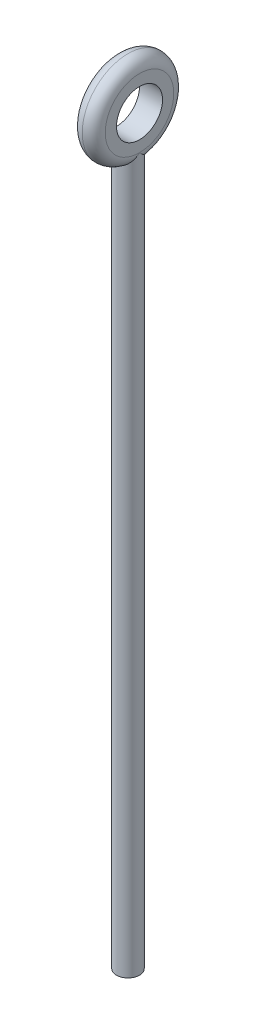
ISO-10303-21;
HEADER;
FILE_DESCRIPTION(('STEP AP214'),'2;1');
FILE_NAME('part.step','',(''),(''),'','','');
FILE_SCHEMA(('AUTOMOTIVE_DESIGN { 1 0 10303 214 1 1 1 1 }'));
ENDSEC;
DATA;
#1=APPLICATION_CONTEXT('core data for automotive mechanical design processes');
#2=APPLICATION_PROTOCOL_DEFINITION('international standard','automotive_design',2000,#1);
#3=PRODUCT_CONTEXT('',#1,'mechanical');
#4=PRODUCT('Part','Part','',(#3));
#5=PRODUCT_RELATED_PRODUCT_CATEGORY('part','',(#4));
#6=PRODUCT_DEFINITION_FORMATION('','',#4);
#7=PRODUCT_DEFINITION_CONTEXT('part definition',#1,'design');
#8=PRODUCT_DEFINITION('design','',#6,#7);
#9=PRODUCT_DEFINITION_SHAPE('','',#8);
#10=(LENGTH_UNIT() NAMED_UNIT(*) SI_UNIT(.MILLI.,.METRE.));
#11=(NAMED_UNIT(*) PLANE_ANGLE_UNIT() SI_UNIT($,.RADIAN.));
#12=(NAMED_UNIT(*) SI_UNIT($,.STERADIAN.) SOLID_ANGLE_UNIT());
#13=UNCERTAINTY_MEASURE_WITH_UNIT(LENGTH_MEASURE(1.E-05),#10,'distance_accuracy_value','');
#14=(GEOMETRIC_REPRESENTATION_CONTEXT(3) GLOBAL_UNCERTAINTY_ASSIGNED_CONTEXT((#13)) GLOBAL_UNIT_ASSIGNED_CONTEXT((#10,
#11,#12)) REPRESENTATION_CONTEXT('',''));
#15=CARTESIAN_POINT('',(0.,0.,0.));
#16=DIRECTION('',(0.,0.,1.));
#17=DIRECTION('',(1.,0.,0.));
#18=AXIS2_PLACEMENT_3D('',#15,#16,#17);
#19=CARTESIAN_POINT('',(3.175,-66.2523069570991,0.));
#20=DIRECTION('',(0.,1.,0.));
#21=DIRECTION('',(0.,0.,1.));
#22=AXIS2_PLACEMENT_3D('',#19,#20,#21);
#23=CYLINDRICAL_SURFACE('',#22,3.175);
#24=CARTESIAN_POINT('',(3.175,-12.2203304017109,3.175));
#25=CARTESIAN_POINT('',(3.25058717877362,-12.2203401520479,3.17501546389478));
#26=CARTESIAN_POINT('',(3.32616511915467,-12.2182431327259,3.17230120144131));
#27=CARTESIAN_POINT('',(3.47667643630509,-12.2099107567217,3.16153133110369));
#28=CARTESIAN_POINT('',(3.55161009033232,-12.2036772807421,3.15347815064083));
#29=CARTESIAN_POINT('',(3.69986312826365,-12.1871930320757,3.13220766395765));
#30=CARTESIAN_POINT('',(3.77318917197463,-12.1769647931453,3.11901932551284));
#31=CARTESIAN_POINT('',(3.91810714464931,-12.1526359234494,3.08770478565967));
#32=CARTESIAN_POINT('',(3.98969895719154,-12.1385350334868,3.06957825373793));
#33=CARTESIAN_POINT('',(4.20092733208115,-12.0907153354785,3.00824057276393));
#34=CARTESIAN_POINT('',(4.33736776169311,-12.051439539428,2.95801934192664));
#35=CARTESIAN_POINT('',(4.59851726014337,-11.9597989942898,2.84160985498486));
#36=CARTESIAN_POINT('',(4.72321279246199,-11.9074193905445,2.77540348089231));
#37=CARTESIAN_POINT('',(4.96660021044291,-11.7877430096744,2.62535814323807));
#38=CARTESIAN_POINT('',(5.084395182898,-11.7197053605964,2.54066107273756));
#39=CARTESIAN_POINT('',(5.30361244004525,-11.5731433082763,2.3600525972756));
#40=CARTESIAN_POINT('',(5.40502754858314,-11.4946143360787,2.26413630863961));
#41=CARTESIAN_POINT('',(5.63611071797704,-11.2891484066768,2.01605137987444));
#42=CARTESIAN_POINT('',(5.75598139164765,-11.1570658669725,1.85897697258496));
#43=CARTESIAN_POINT('',(5.96107985253833,-10.8789298892148,1.5347163236911));
#44=CARTESIAN_POINT('',(6.04622595753829,-10.7328444970927,1.36750729072541));
#45=CARTESIAN_POINT('',(6.19568207391777,-10.405311267525,1.00079433532972));
#46=CARTESIAN_POINT('',(6.25412977153179,-10.222034273568,0.800564308557489));
#47=CARTESIAN_POINT('',(6.33100184410796,-9.84642255570457,0.401780864382179));
#48=CARTESIAN_POINT('',(6.34950000010262,-9.654105200682,0.203225031998789));
#49=CARTESIAN_POINT('',(6.34999666457812,-9.45636032807791,0.00531296478064225));
#50=CARTESIAN_POINT('',(6.34999999772981,-9.4537046565621,0.0026561733122218));
#51=CARTESIAN_POINT('',(6.35,-9.45104847634363,0.));
#52=B_SPLINE_CURVE_WITH_KNOTS('',3,(#24,#25,#26,#27,#28,#29,#30,#31,#32,#33,#34,#35,#36,#37,#38,
#39,#40,#41,#42,#43,#44,#45,#46,#47,#48,#49,#50,#51),.UNSPECIFIED.,.F.,.F.,(4,2,2,2,2,2,2,2,2,2,
2,2,2,4),(0.,0.226668473055774,0.453233958413536,0.678539468695532,0.903860062384818,
1.3534441832624,1.80354028684649,2.28248200752316,2.76163299068898,3.47072626153887,
4.18147803519401,5.01104138546582,5.83907133719956,5.85034076955983),.UNSPECIFIED.);
#53=CARTESIAN_POINT('',(6.35,-9.45104847634363,0.));
#54=VERTEX_POINT('',#53);
#55=CARTESIAN_POINT('',(3.175,-12.2203304017109,3.175));
#56=VERTEX_POINT('',#55);
#57=EDGE_CURVE('E80',#54,#56,#52,.F.);
#58=ORIENTED_EDGE('',*,*,#57,.T.);
#59=CARTESIAN_POINT('',(3.175,-12.2203304017109,3.175));
#60=CARTESIAN_POINT('',(3.09941282122638,-12.2203401520479,3.17501546389478));
#61=CARTESIAN_POINT('',(3.02383488084533,-12.2182431327259,3.17230120144131));
#62=CARTESIAN_POINT('',(2.87332356369491,-12.2099107567217,3.16153133110369));
#63=CARTESIAN_POINT('',(2.79838990966768,-12.2036772807421,3.15347815064083));
#64=CARTESIAN_POINT('',(2.65013687173635,-12.1871930320757,3.13220766395765));
#65=CARTESIAN_POINT('',(2.57681082802537,-12.1769647931453,3.11901932551284));
#66=CARTESIAN_POINT('',(2.43189285535069,-12.1526359234494,3.08770478565967));
#67=CARTESIAN_POINT('',(2.36030104280846,-12.1385350334868,3.06957825373793));
#68=CARTESIAN_POINT('',(2.14907266791885,-12.0907153354785,3.00824057276393));
#69=CARTESIAN_POINT('',(2.01263223830689,-12.051439539428,2.95801934192664));
#70=CARTESIAN_POINT('',(1.75148273985663,-11.9597989942898,2.84160985498486));
#71=CARTESIAN_POINT('',(1.62678720753801,-11.9074193905445,2.77540348089231));
#72=CARTESIAN_POINT('',(1.38339978955709,-11.7877430096744,2.62535814323807));
#73=CARTESIAN_POINT('',(1.265604817102,-11.7197053605964,2.54066107273756));
#74=CARTESIAN_POINT('',(1.04638755995475,-11.5731433082763,2.3600525972756));
#75=CARTESIAN_POINT('',(0.944972451416861,-11.4946143360787,2.26413630863961));
#76=CARTESIAN_POINT('',(0.713889282022964,-11.2891484066768,2.01605137987444));
#77=CARTESIAN_POINT('',(0.594018608352354,-11.1570658669725,1.85897697258496));
#78=CARTESIAN_POINT('',(0.388920147461668,-10.8789298892148,1.5347163236911));
#79=CARTESIAN_POINT('',(0.303774042461712,-10.7328444970927,1.36750729072541));
#80=CARTESIAN_POINT('',(0.154317926082227,-10.405311267525,1.00079433532972));
#81=CARTESIAN_POINT('',(0.095870228468201,-10.222034273568,0.800564308557488));
#82=CARTESIAN_POINT('',(0.0189981558920475,-9.84642255570457,0.40178086438218));
#83=CARTESIAN_POINT('',(0.000499999897405677,-9.65410520068199,0.203225031998791));
#84=CARTESIAN_POINT('',(3.33542188197324E-06,-9.45636032807791,0.00531296478064122));
#85=CARTESIAN_POINT('',(2.27019350190972E-09,-9.4537046565621,0.00265617331222129));
#86=CARTESIAN_POINT('',(0.,-9.45104847634363,0.));
#87=B_SPLINE_CURVE_WITH_KNOTS('',3,(#59,#60,#61,#62,#63,#64,#65,#66,#67,#68,#69,#70,#71,#72,#73,
#74,#75,#76,#77,#78,#79,#80,#81,#82,#83,#84,#85,#86),.UNSPECIFIED.,.F.,.F.,(4,2,2,2,2,2,2,2,2,2,
2,2,2,4),(0.,0.226668473055774,0.453233958413536,0.678539468695532,0.903860062384818,
1.3534441832624,1.80354028684649,2.28248200752316,2.76163299068898,3.47072626153887,
4.18147803519401,5.01104138546581,5.83907133719957,5.85034076955983),.UNSPECIFIED.);
#88=CARTESIAN_POINT('',(0.,-9.45104847634363,0.));
#89=VERTEX_POINT('',#88);
#90=EDGE_CURVE('E11',#56,#89,#87,.T.);
#91=ORIENTED_EDGE('',*,*,#90,.T.);
#92=CARTESIAN_POINT('',(3.175,-12.2203304017109,-3.175));
#93=CARTESIAN_POINT('',(3.09941282122638,-12.2203401520479,-3.17501546389478));
#94=CARTESIAN_POINT('',(3.02383488084533,-12.2182431327259,-3.17230120144131));
#95=CARTESIAN_POINT('',(2.87332356369491,-12.2099107567217,-3.16153133110369));
#96=CARTESIAN_POINT('',(2.79838990966768,-12.2036772807421,-3.15347815064083));
#97=CARTESIAN_POINT('',(2.65013687173635,-12.1871930320757,-3.13220766395765));
#98=CARTESIAN_POINT('',(2.57681082802537,-12.1769647931454,-3.11901932551284));
#99=CARTESIAN_POINT('',(2.43189285535069,-12.1526359234495,-3.08770478565967));
#100=CARTESIAN_POINT('',(2.36030104280846,-12.1385350334868,-3.06957825373793));
#101=CARTESIAN_POINT('',(2.14907266791885,-12.0907153354785,-3.00824057276393));
#102=CARTESIAN_POINT('',(2.01263223830689,-12.051439539428,-2.95801934192664));
#103=CARTESIAN_POINT('',(1.75148273985663,-11.9597989942898,-2.84160985498486));
#104=CARTESIAN_POINT('',(1.62678720753801,-11.9074193905445,-2.77540348089231));
#105=CARTESIAN_POINT('',(1.3833997895571,-11.7877430096744,-2.62535814323807));
#106=CARTESIAN_POINT('',(1.265604817102,-11.7197053605964,-2.54066107273756));
#107=CARTESIAN_POINT('',(1.04638755995475,-11.5731433082763,-2.3600525972756));
#108=CARTESIAN_POINT('',(0.944972451416862,-11.4946143360787,-2.26413630863961));
#109=CARTESIAN_POINT('',(0.713889282022964,-11.2891484066768,-2.01605137987444));
#110=CARTESIAN_POINT('',(0.594018608352355,-11.1570658669725,-1.85897697258496));
#111=CARTESIAN_POINT('',(0.388920147461668,-10.8789298892148,-1.5347163236911));
#112=CARTESIAN_POINT('',(0.303774042461713,-10.7328444970927,-1.36750729072541));
#113=CARTESIAN_POINT('',(0.154317926082228,-10.405311267525,-1.00079433532972));
#114=CARTESIAN_POINT('',(0.0958702284682026,-10.222034273568,-0.800564308557489));
#115=CARTESIAN_POINT('',(0.0189981558920467,-9.84642255570457,-0.401780864382183));
#116=CARTESIAN_POINT('',(0.000499999897401517,-9.65410520068199,-0.203225031998796));
#117=CARTESIAN_POINT('',(3.33542188185887E-06,-9.45636032807791,-0.00531296478064255));
#118=CARTESIAN_POINT('',(2.27019344323859E-09,-9.4537046565621,-0.00265617331222195));
#119=CARTESIAN_POINT('',(0.,-9.45104847634363,0.));
#120=B_SPLINE_CURVE_WITH_KNOTS('',3,(#92,#93,#94,#95,#96,#97,#98,#99,#100,#101,#102,#103,#104,
#105,#106,#107,#108,#109,#110,#111,#112,#113,#114,#115,#116,#117,#118,#119),.UNSPECIFIED.,.F.,
.F.,(4,2,2,2,2,2,2,2,2,2,2,2,2,4),(0.,0.226668473055774,0.453233958413535,0.678539468695532,
0.903860062384818,1.3534441832624,1.80354028684649,2.28248200752316,2.76163299068898,
3.47072626153887,4.18147803519401,5.01104138546581,5.83907133719956,5.85034076955983),.UNSPECIFIED.);
#121=CARTESIAN_POINT('',(3.175,-12.2203304017109,-3.175));
#122=VERTEX_POINT('',#121);
#123=EDGE_CURVE('E56',#89,#122,#120,.F.);
#124=ORIENTED_EDGE('',*,*,#123,.T.);
#125=CARTESIAN_POINT('',(3.175,-12.2203304017109,-3.175));
#126=CARTESIAN_POINT('',(3.25058717877362,-12.2203401520479,-3.17501546389478));
#127=CARTESIAN_POINT('',(3.32616511915467,-12.2182431327259,-3.17230120144131));
#128=CARTESIAN_POINT('',(3.47667643630509,-12.2099107567217,-3.16153133110369));
#129=CARTESIAN_POINT('',(3.55161009033232,-12.2036772807421,-3.15347815064083));
#130=CARTESIAN_POINT('',(3.69986312826365,-12.1871930320757,-3.13220766395765));
#131=CARTESIAN_POINT('',(3.77318917197463,-12.1769647931453,-3.11901932551284));
#132=CARTESIAN_POINT('',(3.91810714464931,-12.1526359234494,-3.08770478565967));
#133=CARTESIAN_POINT('',(3.98969895719154,-12.1385350334868,-3.06957825373793));
#134=CARTESIAN_POINT('',(4.20092733208115,-12.0907153354785,-3.00824057276393));
#135=CARTESIAN_POINT('',(4.33736776169311,-12.051439539428,-2.95801934192664));
#136=CARTESIAN_POINT('',(4.59851726014337,-11.9597989942898,-2.84160985498486));
#137=CARTESIAN_POINT('',(4.72321279246199,-11.9074193905445,-2.77540348089231));
#138=CARTESIAN_POINT('',(4.96660021044291,-11.7877430096744,-2.62535814323807));
#139=CARTESIAN_POINT('',(5.084395182898,-11.7197053605964,-2.54066107273756));
#140=CARTESIAN_POINT('',(5.30361244004525,-11.5731433082763,-2.3600525972756));
#141=CARTESIAN_POINT('',(5.40502754858314,-11.4946143360787,-2.26413630863961));
#142=CARTESIAN_POINT('',(5.63611071797704,-11.2891484066768,-2.01605137987444));
#143=CARTESIAN_POINT('',(5.75598139164765,-11.1570658669725,-1.85897697258496));
#144=CARTESIAN_POINT('',(5.96107985253833,-10.8789298892148,-1.5347163236911));
#145=CARTESIAN_POINT('',(6.04622595753829,-10.7328444970927,-1.36750729072541));
#146=CARTESIAN_POINT('',(6.19568207391777,-10.405311267525,-1.00079433532972));
#147=CARTESIAN_POINT('',(6.25412977153179,-10.222034273568,-0.800564308557489));
#148=CARTESIAN_POINT('',(6.33100184410796,-9.84642255570457,-0.401780864382179));
#149=CARTESIAN_POINT('',(6.34950000010262,-9.654105200682,-0.203225031998789));
#150=CARTESIAN_POINT('',(6.34999666457812,-9.45636032807791,-0.00531296478064225));
#151=CARTESIAN_POINT('',(6.34999999772981,-9.4537046565621,-0.0026561733122218));
#152=CARTESIAN_POINT('',(6.35,-9.45104847634363,0.));
#153=B_SPLINE_CURVE_WITH_KNOTS('',3,(#125,#126,#127,#128,#129,#130,#131,#132,#133,#134,#135,
#136,#137,#138,#139,#140,#141,#142,#143,#144,#145,#146,#147,#148,#149,#150,#151,#152),
.UNSPECIFIED.,.F.,.F.,(4,2,2,2,2,2,2,2,2,2,2,2,2,4),(0.,0.226668473055774,0.453233958413536,
0.678539468695532,0.903860062384818,1.3534441832624,1.80354028684649,2.28248200752316,
2.76163299068898,3.47072626153887,4.18147803519401,5.01104138546582,5.83907133719956,
5.85034076955983),.UNSPECIFIED.);
#154=EDGE_CURVE('E77',#122,#54,#153,.T.);
#155=ORIENTED_EDGE('',*,*,#154,.T.);
#156=EDGE_LOOP('',(#58,#91,#124,#155));
#157=FACE_BOUND('',#156,.T.);
#158=CARTESIAN_POINT('',(3.175,-205.952306957099,0.));
#159=DIRECTION('',(0.,-1.,0.));
#160=DIRECTION('',(0.,0.,-1.));
#161=AXIS2_PLACEMENT_3D('',#158,#159,#160);
#162=CIRCLE('',#161,3.175);
#163=CARTESIAN_POINT('',(3.175,-205.952306957099,-3.175));
#164=VERTEX_POINT('',#163);
#165=EDGE_CURVE('E128',#164,#164,#162,.T.);
#166=ORIENTED_EDGE('',*,*,#165,.F.);
#167=EDGE_LOOP('',(#166));
#168=FACE_BOUND('',#167,.T.);
#169=ADVANCED_FACE('F45',(#157,#168),#23,.T.);
#170=CARTESIAN_POINT('',(6.35,0.,0.));
#171=DIRECTION('',(1.,0.,0.));
#172=DIRECTION('',(0.,0.,-1.));
#173=AXIS2_PLACEMENT_3D('',#170,#171,#172);
#174=PLANE('',#173);
#175=CARTESIAN_POINT('',(6.35,0.,0.));
#176=DIRECTION('',(1.,0.,0.));
#177=DIRECTION('',(0.,0.,-1.));
#178=AXIS2_PLACEMENT_3D('',#175,#176,#177);
#179=CIRCLE('',#178,9.45104847634363);
#180=EDGE_CURVE('E116',#54,#54,#179,.T.);
#181=ORIENTED_EDGE('',*,*,#180,.T.);
#182=EDGE_LOOP('',(#181));
#183=FACE_BOUND('',#182,.T.);
#184=CARTESIAN_POINT('',(6.35,0.,0.));
#185=DIRECTION('',(1.,0.,0.));
#186=DIRECTION('',(0.,0.,-1.));
#187=AXIS2_PLACEMENT_3D('',#184,#185,#186);
#188=CIRCLE('',#187,6.35);
#189=CARTESIAN_POINT('',(6.35,0.,-6.35));
#190=VERTEX_POINT('',#189);
#191=EDGE_CURVE('E120',#190,#190,#188,.T.);
#192=ORIENTED_EDGE('',*,*,#191,.F.);
#193=EDGE_LOOP('',(#192));
#194=FACE_BOUND('',#193,.T.);
#195=ADVANCED_FACE('F99',(#183,#194),#174,.T.);
#196=CARTESIAN_POINT('',(0.,0.,0.));
#197=DIRECTION('',(1.,0.,0.));
#198=DIRECTION('',(0.,0.,-1.));
#199=AXIS2_PLACEMENT_3D('',#196,#197,#198);
#200=PLANE('',#199);
#201=CARTESIAN_POINT('',(0.,0.,0.));
#202=DIRECTION('',(1.,0.,0.));
#203=DIRECTION('',(0.,0.,-1.));
#204=AXIS2_PLACEMENT_3D('',#201,#202,#203);
#205=CIRCLE('',#204,9.45104847634363);
#206=EDGE_CURVE('E75',#89,#89,#205,.F.);
#207=ORIENTED_EDGE('',*,*,#206,.T.);
#208=EDGE_LOOP('',(#207));
#209=FACE_BOUND('',#208,.T.);
#210=CARTESIAN_POINT('',(0.,0.,0.));
#211=DIRECTION('',(1.,0.,0.));
#212=DIRECTION('',(0.,0.,-1.));
#213=AXIS2_PLACEMENT_3D('',#210,#211,#212);
#214=CIRCLE('',#213,6.35);
#215=CARTESIAN_POINT('',(0.,0.,-6.35));
#216=VERTEX_POINT('',#215);
#217=EDGE_CURVE('E124',#216,#216,#214,.T.);
#218=ORIENTED_EDGE('',*,*,#217,.T.);
#219=EDGE_LOOP('',(#218));
#220=FACE_BOUND('',#219,.T.);
#221=ADVANCED_FACE('F142',(#209,#220),#200,.F.);
#222=CARTESIAN_POINT('',(6.35,0.,0.));
#223=DIRECTION('',(-1.,0.,0.));
#224=DIRECTION('',(0.,0.,1.));
#225=AXIS2_PLACEMENT_3D('',#222,#223,#224);
#226=CYLINDRICAL_SURFACE('',#225,6.35);
#227=ORIENTED_EDGE('',*,*,#191,.T.);
#228=EDGE_LOOP('',(#227));
#229=FACE_BOUND('',#228,.T.);
#230=ORIENTED_EDGE('',*,*,#217,.F.);
#231=EDGE_LOOP('',(#230));
#232=FACE_BOUND('',#231,.T.);
#233=ADVANCED_FACE('F100',(#229,#232),#226,.F.);
#234=CARTESIAN_POINT('',(3.175,0.,0.));
#235=DIRECTION('',(1.,0.,0.));
#236=DIRECTION('',(0.,0.,-1.));
#237=AXIS2_PLACEMENT_3D('',#234,#235,#236);
#238=TOROIDAL_SURFACE('',#237,9.45104847634363,3.175);
#239=CARTESIAN_POINT('',(3.175,0.,0.));
#240=DIRECTION('',(1.,0.,0.));
#241=DIRECTION('',(0.,0.,-1.));
#242=AXIS2_PLACEMENT_3D('',#239,#240,#241);
#243=CIRCLE('',#242,12.6260484763436);
#244=EDGE_CURVE('E50',#122,#56,#243,.T.);
#245=ORIENTED_EDGE('',*,*,#244,.F.);
#246=ORIENTED_EDGE('',*,*,#123,.F.);
#247=ORIENTED_EDGE('',*,*,#206,.F.);
#248=ORIENTED_EDGE('',*,*,#90,.F.);
#249=EDGE_LOOP('',(#245,#246,#247,#248));
#250=FACE_BOUND('',#249,.T.);
#251=ADVANCED_FACE('F47',(#250),#238,.T.);
#252=CARTESIAN_POINT('',(3.175,0.,0.));
#253=DIRECTION('',(1.,0.,0.));
#254=DIRECTION('',(0.,0.,-1.));
#255=AXIS2_PLACEMENT_3D('',#252,#253,#254);
#256=TOROIDAL_SURFACE('',#255,9.45104847634363,3.175);
#257=ORIENTED_EDGE('',*,*,#154,.F.);
#258=ORIENTED_EDGE('',*,*,#244,.T.);
#259=ORIENTED_EDGE('',*,*,#57,.F.);
#260=ORIENTED_EDGE('',*,*,#180,.F.);
#261=EDGE_LOOP('',(#257,#258,#259,#260));
#262=FACE_BOUND('',#261,.T.);
#263=ADVANCED_FACE('F102',(#262),#256,.T.);
#264=CARTESIAN_POINT('',(3.175,-205.952306957099,0.));
#265=DIRECTION('',(0.,-1.,0.));
#266=DIRECTION('',(0.,0.,-1.));
#267=AXIS2_PLACEMENT_3D('',#264,#265,#266);
#268=PLANE('',#267);
#269=ORIENTED_EDGE('',*,*,#165,.T.);
#270=EDGE_LOOP('',(#269));
#271=FACE_BOUND('',#270,.T.);
#272=ADVANCED_FACE('F134',(#271),#268,.T.);
#273=CLOSED_SHELL('',(#169,#195,#221,#233,#251,#263,#272));
#274=MANIFOLD_SOLID_BREP('B2',#273);
#275=ADVANCED_BREP_SHAPE_REPRESENTATION('',(#18,#274),#14);
#276=SHAPE_DEFINITION_REPRESENTATION(#9,#275);
ENDSEC;
END-ISO-10303-21;
